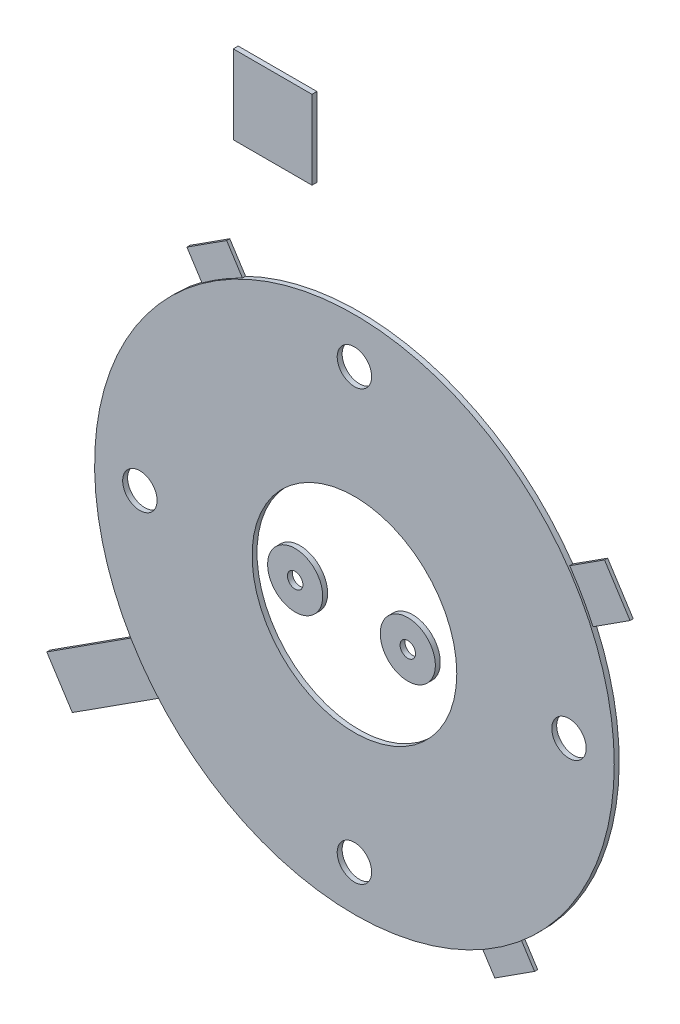
ISO-10303-21;
HEADER;
FILE_DESCRIPTION(('STEP AP214'),'2;1');
FILE_NAME('part.step','',(''),(''),'','','');
FILE_SCHEMA(('AUTOMOTIVE_DESIGN { 1 0 10303 214 1 1 1 1 }'));
ENDSEC;
DATA;
#1=APPLICATION_CONTEXT('core data for automotive mechanical design processes');
#2=APPLICATION_PROTOCOL_DEFINITION('international standard','automotive_design',2000,#1);
#3=PRODUCT_CONTEXT('',#1,'mechanical');
#4=PRODUCT('Part','Part','',(#3));
#5=PRODUCT_RELATED_PRODUCT_CATEGORY('part','',(#4));
#6=PRODUCT_DEFINITION_FORMATION('','',#4);
#7=PRODUCT_DEFINITION_CONTEXT('part definition',#1,'design');
#8=PRODUCT_DEFINITION('design','',#6,#7);
#9=PRODUCT_DEFINITION_SHAPE('','',#8);
#10=(LENGTH_UNIT() NAMED_UNIT(*) SI_UNIT(.MILLI.,.METRE.));
#11=(NAMED_UNIT(*) PLANE_ANGLE_UNIT() SI_UNIT($,.RADIAN.));
#12=(NAMED_UNIT(*) SI_UNIT($,.STERADIAN.) SOLID_ANGLE_UNIT());
#13=UNCERTAINTY_MEASURE_WITH_UNIT(LENGTH_MEASURE(1.E-05),#10,'distance_accuracy_value','');
#14=(GEOMETRIC_REPRESENTATION_CONTEXT(3) GLOBAL_UNCERTAINTY_ASSIGNED_CONTEXT((#13)) GLOBAL_UNIT_ASSIGNED_CONTEXT((#10,
#11,#12)) REPRESENTATION_CONTEXT('',''));
#15=CARTESIAN_POINT('',(0.,0.,0.));
#16=DIRECTION('',(0.,0.,1.));
#17=DIRECTION('',(1.,0.,0.));
#18=AXIS2_PLACEMENT_3D('',#15,#16,#17);
#19=CARTESIAN_POINT('',(-19.115371156758,0.,37.5085244842766));
#20=DIRECTION('',(0.,0.,-1.));
#21=DIRECTION('',(-1.,0.,0.));
#22=AXIS2_PLACEMENT_3D('',#19,#20,#21);
#23=CYLINDRICAL_SURFACE('',#22,8.89);
#24=CARTESIAN_POINT('',(-19.115371156758,0.,0.));
#25=DIRECTION('',(0.,0.,-1.));
#26=DIRECTION('',(-1.,0.,0.));
#27=AXIS2_PLACEMENT_3D('',#24,#25,#26);
#28=CIRCLE('',#27,8.89);
#29=CARTESIAN_POINT('',(-28.005371156758,0.,0.));
#30=VERTEX_POINT('',#29);
#31=EDGE_CURVE('E49',#30,#30,#28,.T.);
#32=ORIENTED_EDGE('',*,*,#31,.F.);
#33=EDGE_LOOP('',(#32));
#34=FACE_BOUND('',#33,.T.);
#35=CARTESIAN_POINT('',(-19.115371156758,0.,1.5875));
#36=DIRECTION('',(0.,0.,1.));
#37=DIRECTION('',(1.,0.,0.));
#38=AXIS2_PLACEMENT_3D('',#35,#36,#37);
#39=CIRCLE('',#38,8.89);
#40=CARTESIAN_POINT('',(-10.225371156758,0.,1.5875));
#41=VERTEX_POINT('',#40);
#42=EDGE_CURVE('E45',#41,#41,#39,.F.);
#43=ORIENTED_EDGE('',*,*,#42,.T.);
#44=EDGE_LOOP('',(#43));
#45=FACE_BOUND('',#44,.T.);
#46=ADVANCED_FACE('F41',(#34,#45),#23,.T.);
#47=CARTESIAN_POINT('',(-19.115371156758,0.,37.5085244842766));
#48=DIRECTION('',(0.,0.,-1.));
#49=DIRECTION('',(-1.,0.,0.));
#50=AXIS2_PLACEMENT_3D('',#47,#48,#49);
#51=CYLINDRICAL_SURFACE('',#50,2.4892);
#52=CARTESIAN_POINT('',(-19.115371156758,0.,0.));
#53=DIRECTION('',(0.,0.,-1.));
#54=DIRECTION('',(-1.,0.,0.));
#55=AXIS2_PLACEMENT_3D('',#52,#53,#54);
#56=CIRCLE('',#55,2.4892);
#57=CARTESIAN_POINT('',(-21.604571156758,0.,0.));
#58=VERTEX_POINT('',#57);
#59=EDGE_CURVE('E53',#58,#58,#56,.T.);
#60=ORIENTED_EDGE('',*,*,#59,.T.);
#61=EDGE_LOOP('',(#60));
#62=FACE_BOUND('',#61,.T.);
#63=CARTESIAN_POINT('',(-19.115371156758,0.,1.5875));
#64=DIRECTION('',(0.,0.,1.));
#65=DIRECTION('',(1.,0.,0.));
#66=AXIS2_PLACEMENT_3D('',#63,#64,#65);
#67=CIRCLE('',#66,2.4892);
#68=CARTESIAN_POINT('',(-16.626171156758,0.,1.5875));
#69=VERTEX_POINT('',#68);
#70=EDGE_CURVE('E11',#69,#69,#67,.F.);
#71=ORIENTED_EDGE('',*,*,#70,.F.);
#72=EDGE_LOOP('',(#71));
#73=FACE_BOUND('',#72,.T.);
#74=ADVANCED_FACE('F68',(#62,#73),#51,.F.);
#75=CARTESIAN_POINT('',(-19.115371156758,0.,0.));
#76=DIRECTION('',(0.,0.,-1.));
#77=DIRECTION('',(-1.,0.,0.));
#78=AXIS2_PLACEMENT_3D('',#75,#76,#77);
#79=PLANE('',#78);
#80=ORIENTED_EDGE('',*,*,#59,.F.);
#81=EDGE_LOOP('',(#80));
#82=FACE_BOUND('',#81,.T.);
#83=ORIENTED_EDGE('',*,*,#31,.T.);
#84=EDGE_LOOP('',(#83));
#85=FACE_BOUND('',#84,.T.);
#86=ADVANCED_FACE('F64',(#82,#85),#79,.T.);
#87=CARTESIAN_POINT('',(0.,0.,1.5875));
#88=DIRECTION('',(0.,0.,1.));
#89=DIRECTION('',(1.,0.,0.));
#90=AXIS2_PLACEMENT_3D('',#87,#88,#89);
#91=PLANE('',#90);
#92=ORIENTED_EDGE('',*,*,#42,.F.);
#93=EDGE_LOOP('',(#92));
#94=FACE_BOUND('',#93,.T.);
#95=ORIENTED_EDGE('',*,*,#70,.T.);
#96=EDGE_LOOP('',(#95));
#97=FACE_BOUND('',#96,.T.);
#98=ADVANCED_FACE('F43',(#94,#97),#91,.T.);
#99=CLOSED_SHELL('',(#46,#74,#86,#98));
#100=MANIFOLD_SOLID_BREP('B2',#99);
#101=CARTESIAN_POINT('',(17.2165453131115,-1.13803811640878,37.5085244842766));
#102=DIRECTION('',(0.,0.,-1.));
#103=DIRECTION('',(-1.,0.,0.));
#104=AXIS2_PLACEMENT_3D('',#101,#102,#103);
#105=CYLINDRICAL_SURFACE('',#104,8.89);
#106=CARTESIAN_POINT('',(17.2165453131115,-1.13803811640878,0.));
#107=DIRECTION('',(0.,0.,-1.));
#108=DIRECTION('',(-1.,0.,0.));
#109=AXIS2_PLACEMENT_3D('',#106,#107,#108);
#110=CIRCLE('',#109,8.89);
#111=CARTESIAN_POINT('',(8.32654531311145,-1.13803811640878,0.));
#112=VERTEX_POINT('',#111);
#113=EDGE_CURVE('E120',#112,#112,#110,.T.);
#114=ORIENTED_EDGE('',*,*,#113,.F.);
#115=EDGE_LOOP('',(#114));
#116=FACE_BOUND('',#115,.T.);
#117=CARTESIAN_POINT('',(17.2165453131115,-1.13803811640878,1.5875));
#118=DIRECTION('',(0.,0.,1.));
#119=DIRECTION('',(1.,0.,0.));
#120=AXIS2_PLACEMENT_3D('',#117,#118,#119);
#121=CIRCLE('',#120,8.89);
#122=CARTESIAN_POINT('',(26.1065453131115,-1.13803811640878,1.5875));
#123=VERTEX_POINT('',#122);
#124=EDGE_CURVE('E116',#123,#123,#121,.F.);
#125=ORIENTED_EDGE('',*,*,#124,.T.);
#126=EDGE_LOOP('',(#125));
#127=FACE_BOUND('',#126,.T.);
#128=ADVANCED_FACE('F112',(#116,#127),#105,.T.);
#129=CARTESIAN_POINT('',(17.2165453131115,-1.13803811640878,37.5085244842766));
#130=DIRECTION('',(0.,0.,-1.));
#131=DIRECTION('',(-1.,0.,0.));
#132=AXIS2_PLACEMENT_3D('',#129,#130,#131);
#133=CYLINDRICAL_SURFACE('',#132,2.4892);
#134=CARTESIAN_POINT('',(17.2165453131115,-1.13803811640878,0.));
#135=DIRECTION('',(0.,0.,-1.));
#136=DIRECTION('',(-1.,0.,0.));
#137=AXIS2_PLACEMENT_3D('',#134,#135,#136);
#138=CIRCLE('',#137,2.4892);
#139=CARTESIAN_POINT('',(14.7273453131115,-1.13803811640878,0.));
#140=VERTEX_POINT('',#139);
#141=EDGE_CURVE('E124',#140,#140,#138,.T.);
#142=ORIENTED_EDGE('',*,*,#141,.T.);
#143=EDGE_LOOP('',(#142));
#144=FACE_BOUND('',#143,.T.);
#145=CARTESIAN_POINT('',(17.2165453131115,-1.13803811640878,1.5875));
#146=DIRECTION('',(0.,0.,1.));
#147=DIRECTION('',(1.,0.,0.));
#148=AXIS2_PLACEMENT_3D('',#145,#146,#147);
#149=CIRCLE('',#148,2.4892);
#150=CARTESIAN_POINT('',(19.7057453131115,-1.13803811640878,1.5875));
#151=VERTEX_POINT('',#150);
#152=EDGE_CURVE('E40',#151,#151,#149,.F.);
#153=ORIENTED_EDGE('',*,*,#152,.F.);
#154=EDGE_LOOP('',(#153));
#155=FACE_BOUND('',#154,.T.);
#156=ADVANCED_FACE('F139',(#144,#155),#133,.F.);
#157=CARTESIAN_POINT('',(17.2165453131115,-1.13803811640878,0.));
#158=DIRECTION('',(0.,0.,-1.));
#159=DIRECTION('',(-1.,0.,0.));
#160=AXIS2_PLACEMENT_3D('',#157,#158,#159);
#161=PLANE('',#160);
#162=ORIENTED_EDGE('',*,*,#141,.F.);
#163=EDGE_LOOP('',(#162));
#164=FACE_BOUND('',#163,.T.);
#165=ORIENTED_EDGE('',*,*,#113,.T.);
#166=EDGE_LOOP('',(#165));
#167=FACE_BOUND('',#166,.T.);
#168=ADVANCED_FACE('F135',(#164,#167),#161,.T.);
#169=CARTESIAN_POINT('',(0.,0.,1.5875));
#170=DIRECTION('',(0.,0.,1.));
#171=DIRECTION('',(1.,0.,0.));
#172=AXIS2_PLACEMENT_3D('',#169,#170,#171);
#173=PLANE('',#172);
#174=ORIENTED_EDGE('',*,*,#124,.F.);
#175=EDGE_LOOP('',(#174));
#176=FACE_BOUND('',#175,.T.);
#177=ORIENTED_EDGE('',*,*,#152,.T.);
#178=EDGE_LOOP('',(#177));
#179=FACE_BOUND('',#178,.T.);
#180=ADVANCED_FACE('F114',(#176,#179),#173,.T.);
#181=CLOSED_SHELL('',(#128,#156,#168,#180));
#182=MANIFOLD_SOLID_BREP('B6',#181);
#183=CARTESIAN_POINT('',(0.,0.,1.5875));
#184=DIRECTION('',(0.,0.,1.));
#185=DIRECTION('',(1.,0.,0.));
#186=AXIS2_PLACEMENT_3D('',#183,#184,#185);
#187=PLANE('',#186);
#188=DIRECTION('',(0.,-1.,0.));
#189=VECTOR('',#188,1.);
#190=CARTESIAN_POINT('',(-13.690137184174,138.482482189097,1.5875));
#191=LINE('',#190,#189);
#192=CARTESIAN_POINT('',(-13.690137184174,138.482482189097,1.5875));
#193=VERTEX_POINT('',#192);
#194=CARTESIAN_POINT('',(-13.690137184174,113.082482189097,1.5875));
#195=VERTEX_POINT('',#194);
#196=EDGE_CURVE('E190',#193,#195,#191,.T.);
#197=ORIENTED_EDGE('',*,*,#196,.F.);
#198=DIRECTION('',(1.,0.,0.));
#199=VECTOR('',#198,1.);
#200=CARTESIAN_POINT('',(-13.690137184174,138.482482189097,1.5875));
#201=LINE('',#200,#199);
#202=CARTESIAN_POINT('',(-39.090137184174,138.482482189097,1.5875));
#203=VERTEX_POINT('',#202);
#204=EDGE_CURVE('E213',#203,#193,#201,.T.);
#205=ORIENTED_EDGE('',*,*,#204,.F.);
#206=DIRECTION('',(0.,1.,0.));
#207=VECTOR('',#206,1.);
#208=CARTESIAN_POINT('',(-39.090137184174,138.482482189097,1.5875));
#209=LINE('',#208,#207);
#210=CARTESIAN_POINT('',(-39.090137184174,113.082482189097,1.5875));
#211=VERTEX_POINT('',#210);
#212=EDGE_CURVE('E218',#211,#203,#209,.T.);
#213=ORIENTED_EDGE('',*,*,#212,.F.);
#214=DIRECTION('',(-1.,0.,0.));
#215=VECTOR('',#214,1.);
#216=CARTESIAN_POINT('',(-13.690137184174,113.082482189097,1.5875));
#217=LINE('',#216,#215);
#218=EDGE_CURVE('E233',#195,#211,#217,.T.);
#219=ORIENTED_EDGE('',*,*,#218,.F.);
#220=EDGE_LOOP('',(#197,#205,#213,#219));
#221=FACE_BOUND('',#220,.T.);
#222=ADVANCED_FACE('F182',(#221),#187,.T.);
#223=CARTESIAN_POINT('',(0.,0.,0.));
#224=DIRECTION('',(0.,0.,-1.));
#225=DIRECTION('',(-1.,0.,0.));
#226=AXIS2_PLACEMENT_3D('',#223,#224,#225);
#227=PLANE('',#226);
#228=DIRECTION('',(0.,-1.,0.));
#229=VECTOR('',#228,1.);
#230=CARTESIAN_POINT('',(-13.690137184174,138.482482189097,0.));
#231=LINE('',#230,#229);
#232=CARTESIAN_POINT('',(-13.690137184174,138.482482189097,0.));
#233=VERTEX_POINT('',#232);
#234=CARTESIAN_POINT('',(-13.690137184174,113.082482189097,0.));
#235=VERTEX_POINT('',#234);
#236=EDGE_CURVE('E242',#233,#235,#231,.T.);
#237=ORIENTED_EDGE('',*,*,#236,.T.);
#238=DIRECTION('',(-1.,0.,0.));
#239=VECTOR('',#238,1.);
#240=CARTESIAN_POINT('',(-13.690137184174,113.082482189097,0.));
#241=LINE('',#240,#239);
#242=CARTESIAN_POINT('',(-39.090137184174,113.082482189097,0.));
#243=VERTEX_POINT('',#242);
#244=EDGE_CURVE('E231',#235,#243,#241,.T.);
#245=ORIENTED_EDGE('',*,*,#244,.T.);
#246=DIRECTION('',(0.,1.,0.));
#247=VECTOR('',#246,1.);
#248=CARTESIAN_POINT('',(-39.090137184174,138.482482189097,0.));
#249=LINE('',#248,#247);
#250=CARTESIAN_POINT('',(-39.090137184174,138.482482189097,0.));
#251=VERTEX_POINT('',#250);
#252=EDGE_CURVE('E234',#243,#251,#249,.T.);
#253=ORIENTED_EDGE('',*,*,#252,.T.);
#254=DIRECTION('',(1.,0.,0.));
#255=VECTOR('',#254,1.);
#256=CARTESIAN_POINT('',(-13.690137184174,138.482482189097,0.));
#257=LINE('',#256,#255);
#258=EDGE_CURVE('E239',#251,#233,#257,.T.);
#259=ORIENTED_EDGE('',*,*,#258,.T.);
#260=EDGE_LOOP('',(#237,#245,#253,#259));
#261=FACE_BOUND('',#260,.T.);
#262=ADVANCED_FACE('F241',(#261),#227,.T.);
#263=CARTESIAN_POINT('',(-13.690137184174,113.082482189097,37.5085244842766));
#264=DIRECTION('',(0.,-1.,0.));
#265=DIRECTION('',(0.,0.,-1.));
#266=AXIS2_PLACEMENT_3D('',#263,#264,#265);
#267=PLANE('',#266);
#268=DIRECTION('',(0.,0.,-1.));
#269=VECTOR('',#268,1.);
#270=CARTESIAN_POINT('',(-13.690137184174,113.082482189097,37.5085244842766));
#271=LINE('',#270,#269);
#272=EDGE_CURVE('E110',#195,#235,#271,.T.);
#273=ORIENTED_EDGE('',*,*,#272,.F.);
#274=ORIENTED_EDGE('',*,*,#218,.T.);
#275=DIRECTION('',(0.,0.,-1.));
#276=VECTOR('',#275,1.);
#277=CARTESIAN_POINT('',(-39.090137184174,113.082482189097,37.5085244842766));
#278=LINE('',#277,#276);
#279=EDGE_CURVE('E228',#211,#243,#278,.T.);
#280=ORIENTED_EDGE('',*,*,#279,.T.);
#281=ORIENTED_EDGE('',*,*,#244,.F.);
#282=EDGE_LOOP('',(#273,#274,#280,#281));
#283=FACE_BOUND('',#282,.T.);
#284=ADVANCED_FACE('F229',(#283),#267,.T.);
#285=CARTESIAN_POINT('',(-39.090137184174,138.482482189097,37.5085244842766));
#286=DIRECTION('',(-1.,0.,0.));
#287=DIRECTION('',(0.,0.,1.));
#288=AXIS2_PLACEMENT_3D('',#285,#286,#287);
#289=PLANE('',#288);
#290=ORIENTED_EDGE('',*,*,#279,.F.);
#291=ORIENTED_EDGE('',*,*,#212,.T.);
#292=DIRECTION('',(0.,0.,-1.));
#293=VECTOR('',#292,1.);
#294=CARTESIAN_POINT('',(-39.090137184174,138.482482189097,37.5085244842766));
#295=LINE('',#294,#293);
#296=EDGE_CURVE('E223',#203,#251,#295,.T.);
#297=ORIENTED_EDGE('',*,*,#296,.T.);
#298=ORIENTED_EDGE('',*,*,#252,.F.);
#299=EDGE_LOOP('',(#290,#291,#297,#298));
#300=FACE_BOUND('',#299,.T.);
#301=ADVANCED_FACE('F235',(#300),#289,.T.);
#302=CARTESIAN_POINT('',(-13.690137184174,138.482482189097,37.5085244842766));
#303=DIRECTION('',(0.,1.,0.));
#304=DIRECTION('',(0.,0.,1.));
#305=AXIS2_PLACEMENT_3D('',#302,#303,#304);
#306=PLANE('',#305);
#307=ORIENTED_EDGE('',*,*,#296,.F.);
#308=ORIENTED_EDGE('',*,*,#204,.T.);
#309=DIRECTION('',(0.,0.,-1.));
#310=VECTOR('',#309,1.);
#311=CARTESIAN_POINT('',(-13.690137184174,138.482482189097,37.5085244842766));
#312=LINE('',#311,#310);
#313=EDGE_CURVE('E249',#193,#233,#312,.T.);
#314=ORIENTED_EDGE('',*,*,#313,.T.);
#315=ORIENTED_EDGE('',*,*,#258,.F.);
#316=EDGE_LOOP('',(#307,#308,#314,#315));
#317=FACE_BOUND('',#316,.T.);
#318=ADVANCED_FACE('F255',(#317),#306,.T.);
#319=CARTESIAN_POINT('',(-13.690137184174,138.482482189097,37.5085244842766));
#320=DIRECTION('',(1.,0.,0.));
#321=DIRECTION('',(0.,0.,-1.));
#322=AXIS2_PLACEMENT_3D('',#319,#320,#321);
#323=PLANE('',#322);
#324=ORIENTED_EDGE('',*,*,#313,.F.);
#325=ORIENTED_EDGE('',*,*,#196,.T.);
#326=ORIENTED_EDGE('',*,*,#272,.T.);
#327=ORIENTED_EDGE('',*,*,#236,.F.);
#328=EDGE_LOOP('',(#324,#325,#326,#327));
#329=FACE_BOUND('',#328,.T.);
#330=ADVANCED_FACE('F256',(#329),#323,.T.);
#331=CLOSED_SHELL('',(#222,#262,#284,#301,#318,#330));
#332=MANIFOLD_SOLID_BREP('B35',#331);
#333=CARTESIAN_POINT('',(0.,0.,1.5875));
#334=DIRECTION('',(0.,0.,1.));
#335=DIRECTION('',(1.,0.,0.));
#336=AXIS2_PLACEMENT_3D('',#333,#334,#335);
#337=PLANE('',#336);
#338=CARTESIAN_POINT('',(69.215,0.,1.5875));
#339=DIRECTION('',(0.,0.,1.));
#340=DIRECTION('',(1.,0.,0.));
#341=AXIS2_PLACEMENT_3D('',#338,#339,#340);
#342=CIRCLE('',#341,5.55625000000002);
#343=CARTESIAN_POINT('',(74.77125,0.,1.5875));
#344=VERTEX_POINT('',#343);
#345=EDGE_CURVE('E516',#344,#344,#342,.T.);
#346=ORIENTED_EDGE('',*,*,#345,.F.);
#347=EDGE_LOOP('',(#346));
#348=FACE_BOUND('',#347,.T.);
#349=CARTESIAN_POINT('',(-69.215,0.,1.5875));
#350=DIRECTION('',(0.,0.,1.));
#351=DIRECTION('',(1.,0.,0.));
#352=AXIS2_PLACEMENT_3D('',#349,#350,#351);
#353=CIRCLE('',#352,5.55625);
#354=CARTESIAN_POINT('',(-63.65875,0.,1.5875));
#355=VERTEX_POINT('',#354);
#356=EDGE_CURVE('E528',#355,#355,#353,.T.);
#357=ORIENTED_EDGE('',*,*,#356,.F.);
#358=EDGE_LOOP('',(#357));
#359=FACE_BOUND('',#358,.T.);
#360=CARTESIAN_POINT('',(0.,0.,1.5875));
#361=DIRECTION('',(0.,0.,1.));
#362=DIRECTION('',(1.,0.,0.));
#363=AXIS2_PLACEMENT_3D('',#360,#361,#362);
#364=CIRCLE('',#363,83.82);
#365=CARTESIAN_POINT('',(83.82,0.,1.5875));
#366=VERTEX_POINT('',#365);
#367=EDGE_CURVE('E540',#366,#366,#364,.T.);
#368=ORIENTED_EDGE('',*,*,#367,.T.);
#369=EDGE_LOOP('',(#368));
#370=FACE_BOUND('',#369,.T.);
#371=CARTESIAN_POINT('',(0.,0.,1.5875));
#372=DIRECTION('',(0.,0.,1.));
#373=DIRECTION('',(1.,0.,0.));
#374=AXIS2_PLACEMENT_3D('',#371,#372,#373);
#375=CIRCLE('',#374,33.02);
#376=CARTESIAN_POINT('',(33.02,0.,1.5875));
#377=VERTEX_POINT('',#376);
#378=EDGE_CURVE('E534',#377,#377,#375,.T.);
#379=ORIENTED_EDGE('',*,*,#378,.F.);
#380=EDGE_LOOP('',(#379));
#381=FACE_BOUND('',#380,.T.);
#382=CARTESIAN_POINT('',(0.,69.215,1.5875));
#383=DIRECTION('',(0.,0.,1.));
#384=DIRECTION('',(1.,0.,0.));
#385=AXIS2_PLACEMENT_3D('',#382,#383,#384);
#386=CIRCLE('',#385,5.55624999999999);
#387=CARTESIAN_POINT('',(5.55624999999999,69.215,1.5875));
#388=VERTEX_POINT('',#387);
#389=EDGE_CURVE('E522',#388,#388,#386,.T.);
#390=ORIENTED_EDGE('',*,*,#389,.F.);
#391=EDGE_LOOP('',(#390));
#392=FACE_BOUND('',#391,.T.);
#393=CARTESIAN_POINT('',(0.,-69.215,1.5875));
#394=DIRECTION('',(0.,0.,1.));
#395=DIRECTION('',(1.,0.,0.));
#396=AXIS2_PLACEMENT_3D('',#393,#394,#395);
#397=CIRCLE('',#396,5.55624999999999);
#398=CARTESIAN_POINT('',(5.55624999999999,-69.215,1.5875));
#399=VERTEX_POINT('',#398);
#400=EDGE_CURVE('E510',#399,#399,#397,.T.);
#401=ORIENTED_EDGE('',*,*,#400,.F.);
#402=EDGE_LOOP('',(#401));
#403=FACE_BOUND('',#402,.T.);
#404=ADVANCED_FACE('F305',(#348,#359,#370,#381,#392,#403),#337,.T.);
#405=CARTESIAN_POINT('',(0.,0.,0.));
#406=DIRECTION('',(0.,0.,1.));
#407=DIRECTION('',(1.,0.,0.));
#408=AXIS2_PLACEMENT_3D('',#405,#406,#407);
#409=PLANE('',#408);
#410=DIRECTION('',(0.841208650230531,0.540710649772435,0.));
#411=VECTOR('',#410,1.);
#412=CARTESIAN_POINT('',(-53.9080953398317,-31.1364566302345,0.));
#413=LINE('',#412,#411);
#414=CARTESIAN_POINT('',(-99.8144587122875,-60.6440699447287,0.));
#415=VERTEX_POINT('',#414);
#416=CARTESIAN_POINT('',(-72.0648065841038,-42.8071962641296,0.));
#417=VERTEX_POINT('',#416);
#418=EDGE_CURVE('E439',#415,#417,#413,.T.);
#419=ORIENTED_EDGE('',*,*,#418,.T.);
#420=CARTESIAN_POINT('',(0.,0.,0.));
#421=DIRECTION('',(0.,0.,1.));
#422=DIRECTION('',(1.,0.,0.));
#423=AXIS2_PLACEMENT_3D('',#420,#421,#422);
#424=CIRCLE('',#423,83.82);
#425=CARTESIAN_POINT('',(-49.7423472905781,67.4647410580039,0.));
#426=VERTEX_POINT('',#425);
#427=EDGE_CURVE('E546',#426,#417,#424,.T.);
#428=ORIENTED_EDGE('',*,*,#427,.F.);
#429=DIRECTION('',(-0.540710649772435,0.84120865023053,0.));
#430=VECTOR('',#429,1.);
#431=CARTESIAN_POINT('',(-44.1784904359033,58.808790751187,0.));
#432=LINE('',#431,#430);
#433=CARTESIAN_POINT('',(-54.6166201182401,75.0478734929551,0.));
#434=VERTEX_POINT('',#433);
#435=EDGE_CURVE('E459',#426,#434,#432,.T.);
#436=ORIENTED_EDGE('',*,*,#435,.T.);
#437=DIRECTION('',(0.841208650230531,0.540710649772434,0.));
#438=VECTOR('',#437,1.);
#439=CARTESIAN_POINT('',(-41.7966002887268,83.288303795487,0.));
#440=LINE('',#439,#438);
#441=CARTESIAN_POINT('',(-41.7966002887268,83.288303795487,0.));
#442=VERTEX_POINT('',#441);
#443=EDGE_CURVE('E451',#434,#442,#440,.T.);
#444=ORIENTED_EDGE('',*,*,#443,.T.);
#445=DIRECTION('',(0.540710649772435,-0.841208650230531,0.));
#446=VECTOR('',#445,1.);
#447=CARTESIAN_POINT('',(-31.35847060639,67.0492210537189,0.));
#448=LINE('',#447,#446);
#449=CARTESIAN_POINT('',(-36.6996114754435,75.3586817662802,0.));
#450=VERTEX_POINT('',#449);
#451=EDGE_CURVE('E445',#442,#450,#448,.T.);
#452=ORIENTED_EDGE('',*,*,#451,.T.);
#453=CARTESIAN_POINT('',(68.8676660465004,47.7811361659358,0.));
#454=VERTEX_POINT('',#453);
#455=EDGE_CURVE('E544',#454,#450,#424,.T.);
#456=ORIENTED_EDGE('',*,*,#455,.F.);
#457=DIRECTION('',(0.841208650230531,0.540710649772435,0.));
#458=VECTOR('',#457,1.);
#459=CARTESIAN_POINT('',(58.5933201152434,41.1770097545463,0.));
#460=LINE('',#459,#458);
#461=CARTESIAN_POINT('',(80.1050038135126,55.0042528136881,0.));
#462=VERTEX_POINT('',#461);
#463=EDGE_CURVE('E486',#454,#462,#460,.T.);
#464=ORIENTED_EDGE('',*,*,#463,.T.);
#465=DIRECTION('',(0.540710649772434,-0.841208650230531,0.));
#466=VECTOR('',#465,1.);
#467=CARTESIAN_POINT('',(80.1050038135126,55.0042528136881,0.));
#468=LINE('',#467,#466);
#469=CARTESIAN_POINT('',(88.3454341160444,42.184232984175,0.));
#470=VERTEX_POINT('',#469);
#471=EDGE_CURVE('E500',#462,#470,#468,.T.);
#472=ORIENTED_EDGE('',*,*,#471,.T.);
#473=DIRECTION('',(-0.84120865023053,-0.540710649772436,0.));
#474=VECTOR('',#473,1.);
#475=CARTESIAN_POINT('',(66.8337504177752,28.3569899250331,0.));
#476=LINE('',#475,#474);
#477=CARTESIAN_POINT('',(76.3907206709252,34.5000028315461,0.));
#478=VERTEX_POINT('',#477);
#479=EDGE_CURVE('E492',#470,#478,#476,.T.);
#480=ORIENTED_EDGE('',*,*,#479,.T.);
#481=CARTESIAN_POINT('',(53.3138375609136,-64.6794180905218,0.));
#482=VERTEX_POINT('',#481);
#483=EDGE_CURVE('E537',#482,#478,#424,.T.);
#484=ORIENTED_EDGE('',*,*,#483,.F.);
#485=DIRECTION('',(0.540710649772436,-0.84120865023053,0.));
#486=VECTOR('',#485,1.);
#487=CARTESIAN_POINT('',(48.5277998812423,-57.2335571699663,0.));
#488=LINE('',#487,#486);
#489=CARTESIAN_POINT('',(57.5312655469694,-71.2406665236487,0.));
#490=VERTEX_POINT('',#489);
#491=EDGE_CURVE('E465',#482,#490,#488,.T.);
#492=ORIENTED_EDGE('',*,*,#491,.T.);
#493=DIRECTION('',(-0.84120865023053,-0.540710649772436,0.));
#494=VECTOR('',#493,1.);
#495=CARTESIAN_POINT('',(57.5312655469694,-71.2406665236487,0.));
#496=LINE('',#495,#494);
#497=CARTESIAN_POINT('',(44.7112457174561,-79.4810968261806,0.));
#498=VERTEX_POINT('',#497);
#499=EDGE_CURVE('E479',#490,#498,#496,.T.);
#500=ORIENTED_EDGE('',*,*,#499,.T.);
#501=DIRECTION('',(-0.540710649772435,0.84120865023053,0.));
#502=VECTOR('',#501,1.);
#503=CARTESIAN_POINT('',(35.7077800517291,-65.4739874724982,0.));
#504=LINE('',#503,#502);
#505=CARTESIAN_POINT('',(40.7165337170217,-73.2663379873092,0.));
#506=VERTEX_POINT('',#505);
#507=EDGE_CURVE('E471',#498,#506,#504,.T.);
#508=ORIENTED_EDGE('',*,*,#507,.T.);
#509=CARTESIAN_POINT('',(-63.1070006034648,-55.1661025887663,0.));
#510=VERTEX_POINT('',#509);
#511=EDGE_CURVE('E547',#510,#506,#424,.T.);
#512=ORIENTED_EDGE('',*,*,#511,.F.);
#513=DIRECTION('',(-0.84120865023053,-0.540710649772435,0.));
#514=VECTOR('',#513,1.);
#515=CARTESIAN_POINT('',(-45.6676650372998,-43.9564764597478,0.));
#516=LINE('',#515,#514);
#517=CARTESIAN_POINT('',(-91.5740284097556,-73.464089774242,0.));
#518=VERTEX_POINT('',#517);
#519=EDGE_CURVE('E442',#510,#518,#516,.T.);
#520=ORIENTED_EDGE('',*,*,#519,.T.);
#521=DIRECTION('',(-0.540710649772436,0.84120865023053,0.));
#522=VECTOR('',#521,1.);
#523=CARTESIAN_POINT('',(-99.8144587122875,-60.6440699447287,0.));
#524=LINE('',#523,#522);
#525=EDGE_CURVE('E430',#518,#415,#524,.T.);
#526=ORIENTED_EDGE('',*,*,#525,.T.);
#527=EDGE_LOOP('',(#419,#428,#436,#444,#452,#456,#464,#472,#480,#484,#492,#500,#508,#512,#520,#526));
#528=FACE_BOUND('',#527,.T.);
#529=CARTESIAN_POINT('',(0.,0.,0.));
#530=DIRECTION('',(0.,0.,1.));
#531=DIRECTION('',(1.,0.,0.));
#532=AXIS2_PLACEMENT_3D('',#529,#530,#531);
#533=CIRCLE('',#532,33.02);
#534=CARTESIAN_POINT('',(33.02,0.,0.));
#535=VERTEX_POINT('',#534);
#536=EDGE_CURVE('E531',#535,#535,#533,.T.);
#537=ORIENTED_EDGE('',*,*,#536,.T.);
#538=EDGE_LOOP('',(#537));
#539=FACE_BOUND('',#538,.T.);
#540=CARTESIAN_POINT('',(-69.215,0.,0.));
#541=DIRECTION('',(0.,0.,1.));
#542=DIRECTION('',(1.,0.,0.));
#543=AXIS2_PLACEMENT_3D('',#540,#541,#542);
#544=CIRCLE('',#543,5.55625);
#545=CARTESIAN_POINT('',(-63.65875,0.,0.));
#546=VERTEX_POINT('',#545);
#547=EDGE_CURVE('E525',#546,#546,#544,.T.);
#548=ORIENTED_EDGE('',*,*,#547,.T.);
#549=EDGE_LOOP('',(#548));
#550=FACE_BOUND('',#549,.T.);
#551=CARTESIAN_POINT('',(0.,69.215,0.));
#552=DIRECTION('',(0.,0.,1.));
#553=DIRECTION('',(1.,0.,0.));
#554=AXIS2_PLACEMENT_3D('',#551,#552,#553);
#555=CIRCLE('',#554,5.55624999999999);
#556=CARTESIAN_POINT('',(5.55624999999999,69.215,0.));
#557=VERTEX_POINT('',#556);
#558=EDGE_CURVE('E519',#557,#557,#555,.T.);
#559=ORIENTED_EDGE('',*,*,#558,.T.);
#560=EDGE_LOOP('',(#559));
#561=FACE_BOUND('',#560,.T.);
#562=CARTESIAN_POINT('',(69.215,0.,0.));
#563=DIRECTION('',(0.,0.,1.));
#564=DIRECTION('',(1.,0.,0.));
#565=AXIS2_PLACEMENT_3D('',#562,#563,#564);
#566=CIRCLE('',#565,5.55625000000002);
#567=CARTESIAN_POINT('',(74.77125,0.,0.));
#568=VERTEX_POINT('',#567);
#569=EDGE_CURVE('E513',#568,#568,#566,.T.);
#570=ORIENTED_EDGE('',*,*,#569,.T.);
#571=EDGE_LOOP('',(#570));
#572=FACE_BOUND('',#571,.T.);
#573=CARTESIAN_POINT('',(0.,-69.215,0.));
#574=DIRECTION('',(0.,0.,1.));
#575=DIRECTION('',(1.,0.,0.));
#576=AXIS2_PLACEMENT_3D('',#573,#574,#575);
#577=CIRCLE('',#576,5.55624999999999);
#578=CARTESIAN_POINT('',(5.55624999999999,-69.215,0.));
#579=VERTEX_POINT('',#578);
#580=EDGE_CURVE('E507',#579,#579,#577,.T.);
#581=ORIENTED_EDGE('',*,*,#580,.T.);
#582=EDGE_LOOP('',(#581));
#583=FACE_BOUND('',#582,.T.);
#584=ADVANCED_FACE('F573',(#528,#539,#550,#561,#572,#583),#409,.F.);
#585=CARTESIAN_POINT('',(0.,0.,1.5875));
#586=DIRECTION('',(0.,0.,-1.));
#587=DIRECTION('',(-1.,0.,0.));
#588=AXIS2_PLACEMENT_3D('',#585,#586,#587);
#589=CYLINDRICAL_SURFACE('',#588,83.82);
#590=ORIENTED_EDGE('',*,*,#427,.T.);
#591=DIRECTION('',(0.,0.,-1.));
#592=VECTOR('',#591,1.);
#593=CARTESIAN_POINT('',(-72.0648065841038,-42.8071962641296,1.5875));
#594=LINE('',#593,#592);
#595=CARTESIAN_POINT('',(-72.0648065841038,-42.8071962641296,1.016));
#596=VERTEX_POINT('',#595);
#597=EDGE_CURVE('E180',#417,#596,#594,.F.);
#598=ORIENTED_EDGE('',*,*,#597,.T.);
#599=CARTESIAN_POINT('',(0.,0.,1.016));
#600=DIRECTION('',(0.,0.,1.));
#601=DIRECTION('',(1.,0.,0.));
#602=AXIS2_PLACEMENT_3D('',#599,#600,#601);
#603=CIRCLE('',#602,83.82);
#604=CARTESIAN_POINT('',(-63.1070006034648,-55.1661025887663,1.016));
#605=VERTEX_POINT('',#604);
#606=EDGE_CURVE('E319',#596,#605,#603,.T.);
#607=ORIENTED_EDGE('',*,*,#606,.T.);
#608=DIRECTION('',(0.,0.,-1.));
#609=VECTOR('',#608,1.);
#610=CARTESIAN_POINT('',(-63.1070006034648,-55.1661025887664,1.5875));
#611=LINE('',#610,#609);
#612=EDGE_CURVE('E313',#605,#510,#611,.T.);
#613=ORIENTED_EDGE('',*,*,#612,.T.);
#614=ORIENTED_EDGE('',*,*,#511,.T.);
#615=DIRECTION('',(0.,0.,-1.));
#616=VECTOR('',#615,1.);
#617=CARTESIAN_POINT('',(40.7165337170217,-73.2663379873092,1.5875));
#618=LINE('',#617,#616);
#619=CARTESIAN_POINT('',(40.7165337170217,-73.2663379873092,1.016));
#620=VERTEX_POINT('',#619);
#621=EDGE_CURVE('E558',#506,#620,#618,.F.);
#622=ORIENTED_EDGE('',*,*,#621,.T.);
#623=CARTESIAN_POINT('',(0.,0.,1.016));
#624=DIRECTION('',(0.,0.,-1.));
#625=DIRECTION('',(-1.,0.,0.));
#626=AXIS2_PLACEMENT_3D('',#623,#624,#625);
#627=CIRCLE('',#626,83.82);
#628=CARTESIAN_POINT('',(53.3138375609136,-64.6794180905218,1.016));
#629=VERTEX_POINT('',#628);
#630=EDGE_CURVE('E555',#629,#620,#627,.T.);
#631=ORIENTED_EDGE('',*,*,#630,.F.);
#632=DIRECTION('',(0.,0.,-1.));
#633=VECTOR('',#632,1.);
#634=CARTESIAN_POINT('',(53.3138375609136,-64.6794180905218,1.5875));
#635=LINE('',#634,#633);
#636=EDGE_CURVE('E560',#629,#482,#635,.T.);
#637=ORIENTED_EDGE('',*,*,#636,.T.);
#638=ORIENTED_EDGE('',*,*,#483,.T.);
#639=DIRECTION('',(0.,0.,-1.));
#640=VECTOR('',#639,1.);
#641=CARTESIAN_POINT('',(76.3907206709252,34.5000028315461,1.5875));
#642=LINE('',#641,#640);
#643=CARTESIAN_POINT('',(76.3907206709252,34.5000028315461,1.016));
#644=VERTEX_POINT('',#643);
#645=EDGE_CURVE('E550',#478,#644,#642,.F.);
#646=ORIENTED_EDGE('',*,*,#645,.T.);
#647=CARTESIAN_POINT('',(0.,0.,1.016));
#648=DIRECTION('',(0.,0.,-1.));
#649=DIRECTION('',(-1.,0.,0.));
#650=AXIS2_PLACEMENT_3D('',#647,#648,#649);
#651=CIRCLE('',#650,83.82);
#652=CARTESIAN_POINT('',(68.8676660465004,47.7811361659358,1.016));
#653=VERTEX_POINT('',#652);
#654=EDGE_CURVE('E543',#653,#644,#651,.T.);
#655=ORIENTED_EDGE('',*,*,#654,.F.);
#656=DIRECTION('',(0.,0.,-1.));
#657=VECTOR('',#656,1.);
#658=CARTESIAN_POINT('',(68.8676660465004,47.7811361659358,1.5875));
#659=LINE('',#658,#657);
#660=EDGE_CURVE('E552',#653,#454,#659,.T.);
#661=ORIENTED_EDGE('',*,*,#660,.T.);
#662=ORIENTED_EDGE('',*,*,#455,.T.);
#663=DIRECTION('',(0.,0.,-1.));
#664=VECTOR('',#663,1.);
#665=CARTESIAN_POINT('',(-36.6996114754435,75.3586817662802,1.5875));
#666=LINE('',#665,#664);
#667=CARTESIAN_POINT('',(-36.6996114754435,75.3586817662802,1.016));
#668=VERTEX_POINT('',#667);
#669=EDGE_CURVE('E568',#450,#668,#666,.F.);
#670=ORIENTED_EDGE('',*,*,#669,.T.);
#671=CARTESIAN_POINT('',(0.,0.,1.016));
#672=DIRECTION('',(0.,0.,1.));
#673=DIRECTION('',(1.,0.,0.));
#674=AXIS2_PLACEMENT_3D('',#671,#672,#673);
#675=CIRCLE('',#674,83.82);
#676=CARTESIAN_POINT('',(-49.7423472905781,67.4647410580039,1.016));
#677=VERTEX_POINT('',#676);
#678=EDGE_CURVE('E563',#668,#677,#675,.T.);
#679=ORIENTED_EDGE('',*,*,#678,.T.);
#680=DIRECTION('',(0.,0.,-1.));
#681=VECTOR('',#680,1.);
#682=CARTESIAN_POINT('',(-49.7423472905781,67.4647410580039,1.5875));
#683=LINE('',#682,#681);
#684=EDGE_CURVE('E565',#677,#426,#683,.T.);
#685=ORIENTED_EDGE('',*,*,#684,.T.);
#686=EDGE_LOOP('',(#590,#598,#607,#613,#614,#622,#631,#637,#638,#646,#655,#661,#662,#670,#679,#685));
#687=FACE_BOUND('',#686,.T.);
#688=ORIENTED_EDGE('',*,*,#367,.F.);
#689=EDGE_LOOP('',(#688));
#690=FACE_BOUND('',#689,.T.);
#691=ADVANCED_FACE('F307',(#687,#690),#589,.T.);
#692=CARTESIAN_POINT('',(0.,0.,1.5875));
#693=DIRECTION('',(0.,0.,-1.));
#694=DIRECTION('',(-1.,0.,0.));
#695=AXIS2_PLACEMENT_3D('',#692,#693,#694);
#696=CYLINDRICAL_SURFACE('',#695,33.02);
#697=ORIENTED_EDGE('',*,*,#378,.T.);
#698=EDGE_LOOP('',(#697));
#699=FACE_BOUND('',#698,.T.);
#700=ORIENTED_EDGE('',*,*,#536,.F.);
#701=EDGE_LOOP('',(#700));
#702=FACE_BOUND('',#701,.T.);
#703=ADVANCED_FACE('F617',(#699,#702),#696,.F.);
#704=CARTESIAN_POINT('',(-69.215,0.,1.5875));
#705=DIRECTION('',(0.,0.,-1.));
#706=DIRECTION('',(-1.,0.,0.));
#707=AXIS2_PLACEMENT_3D('',#704,#705,#706);
#708=CYLINDRICAL_SURFACE('',#707,5.55625);
#709=ORIENTED_EDGE('',*,*,#356,.T.);
#710=EDGE_LOOP('',(#709));
#711=FACE_BOUND('',#710,.T.);
#712=ORIENTED_EDGE('',*,*,#547,.F.);
#713=EDGE_LOOP('',(#712));
#714=FACE_BOUND('',#713,.T.);
#715=ADVANCED_FACE('F620',(#711,#714),#708,.F.);
#716=CARTESIAN_POINT('',(0.,69.215,1.5875));
#717=DIRECTION('',(0.,0.,-1.));
#718=DIRECTION('',(-1.,0.,0.));
#719=AXIS2_PLACEMENT_3D('',#716,#717,#718);
#720=CYLINDRICAL_SURFACE('',#719,5.55624999999999);
#721=ORIENTED_EDGE('',*,*,#389,.T.);
#722=EDGE_LOOP('',(#721));
#723=FACE_BOUND('',#722,.T.);
#724=ORIENTED_EDGE('',*,*,#558,.F.);
#725=EDGE_LOOP('',(#724));
#726=FACE_BOUND('',#725,.T.);
#727=ADVANCED_FACE('F624',(#723,#726),#720,.F.);
#728=CARTESIAN_POINT('',(69.215,0.,1.5875));
#729=DIRECTION('',(0.,0.,-1.));
#730=DIRECTION('',(-1.,0.,0.));
#731=AXIS2_PLACEMENT_3D('',#728,#729,#730);
#732=CYLINDRICAL_SURFACE('',#731,5.55625000000002);
#733=ORIENTED_EDGE('',*,*,#345,.T.);
#734=EDGE_LOOP('',(#733));
#735=FACE_BOUND('',#734,.T.);
#736=ORIENTED_EDGE('',*,*,#569,.F.);
#737=EDGE_LOOP('',(#736));
#738=FACE_BOUND('',#737,.T.);
#739=ADVANCED_FACE('F604',(#735,#738),#732,.F.);
#740=CARTESIAN_POINT('',(0.,-69.215,1.5875));
#741=DIRECTION('',(0.,0.,-1.));
#742=DIRECTION('',(-1.,0.,0.));
#743=AXIS2_PLACEMENT_3D('',#740,#741,#742);
#744=CYLINDRICAL_SURFACE('',#743,5.55624999999999);
#745=ORIENTED_EDGE('',*,*,#400,.T.);
#746=EDGE_LOOP('',(#745));
#747=FACE_BOUND('',#746,.T.);
#748=ORIENTED_EDGE('',*,*,#580,.F.);
#749=EDGE_LOOP('',(#748));
#750=FACE_BOUND('',#749,.T.);
#751=ADVANCED_FACE('F596',(#747,#750),#744,.F.);
#752=CARTESIAN_POINT('',(58.5933201152434,41.1770097545463,1.016));
#753=DIRECTION('',(-0.540710649772435,0.841208650230531,0.));
#754=DIRECTION('',(-0.841208650230531,-0.540710649772435,0.));
#755=AXIS2_PLACEMENT_3D('',#752,#753,#754);
#756=PLANE('',#755);
#757=ORIENTED_EDGE('',*,*,#660,.F.);
#758=DIRECTION('',(0.841208650230531,0.540710649772435,0.));
#759=VECTOR('',#758,1.);
#760=CARTESIAN_POINT('',(58.5933201152434,41.1770097545463,1.016));
#761=LINE('',#760,#759);
#762=CARTESIAN_POINT('',(80.1050038135126,55.0042528136881,1.016));
#763=VERTEX_POINT('',#762);
#764=EDGE_CURVE('E489',#653,#763,#761,.T.);
#765=ORIENTED_EDGE('',*,*,#764,.T.);
#766=DIRECTION('',(0.,0.,-1.));
#767=VECTOR('',#766,1.);
#768=CARTESIAN_POINT('',(80.1050038135126,55.0042528136881,1.016));
#769=LINE('',#768,#767);
#770=EDGE_CURVE('E498',#763,#462,#769,.T.);
#771=ORIENTED_EDGE('',*,*,#770,.T.);
#772=ORIENTED_EDGE('',*,*,#463,.F.);
#773=EDGE_LOOP('',(#757,#765,#771,#772));
#774=FACE_BOUND('',#773,.T.);
#775=ADVANCED_FACE('F594',(#774),#756,.T.);
#776=CARTESIAN_POINT('',(66.8337504177752,28.3569899250331,1.016));
#777=DIRECTION('',(0.540710649772436,-0.84120865023053,0.));
#778=DIRECTION('',(0.84120865023053,0.540710649772436,0.));
#779=AXIS2_PLACEMENT_3D('',#776,#777,#778);
#780=PLANE('',#779);
#781=ORIENTED_EDGE('',*,*,#645,.F.);
#782=ORIENTED_EDGE('',*,*,#479,.F.);
#783=DIRECTION('',(0.,0.,-1.));
#784=VECTOR('',#783,1.);
#785=CARTESIAN_POINT('',(88.3454341160444,42.184232984175,1.016));
#786=LINE('',#785,#784);
#787=CARTESIAN_POINT('',(88.3454341160444,42.184232984175,1.016));
#788=VERTEX_POINT('',#787);
#789=EDGE_CURVE('E505',#788,#470,#786,.T.);
#790=ORIENTED_EDGE('',*,*,#789,.F.);
#791=DIRECTION('',(-0.84120865023053,-0.540710649772436,0.));
#792=VECTOR('',#791,1.);
#793=CARTESIAN_POINT('',(66.8337504177752,28.3569899250331,1.016));
#794=LINE('',#793,#792);
#795=EDGE_CURVE('E495',#788,#644,#794,.T.);
#796=ORIENTED_EDGE('',*,*,#795,.T.);
#797=EDGE_LOOP('',(#781,#782,#790,#796));
#798=FACE_BOUND('',#797,.T.);
#799=ADVANCED_FACE('F581',(#798),#780,.T.);
#800=CARTESIAN_POINT('',(80.1050038135126,55.0042528136881,1.016));
#801=DIRECTION('',(0.841208650230531,0.540710649772434,0.));
#802=DIRECTION('',(-0.540710649772434,0.841208650230531,0.));
#803=AXIS2_PLACEMENT_3D('',#800,#801,#802);
#804=PLANE('',#803);
#805=ORIENTED_EDGE('',*,*,#471,.F.);
#806=ORIENTED_EDGE('',*,*,#770,.F.);
#807=DIRECTION('',(0.540710649772434,-0.841208650230531,0.));
#808=VECTOR('',#807,1.);
#809=CARTESIAN_POINT('',(80.1050038135126,55.0042528136881,1.016));
#810=LINE('',#809,#808);
#811=EDGE_CURVE('E491',#763,#788,#810,.T.);
#812=ORIENTED_EDGE('',*,*,#811,.T.);
#813=ORIENTED_EDGE('',*,*,#789,.T.);
#814=EDGE_LOOP('',(#805,#806,#812,#813));
#815=FACE_BOUND('',#814,.T.);
#816=ADVANCED_FACE('F587',(#815),#804,.T.);
#817=CARTESIAN_POINT('',(0.,0.,1.016));
#818=DIRECTION('',(0.,0.,-1.));
#819=DIRECTION('',(-1.,0.,0.));
#820=AXIS2_PLACEMENT_3D('',#817,#818,#819);
#821=PLANE('',#820);
#822=ORIENTED_EDGE('',*,*,#764,.F.);
#823=ORIENTED_EDGE('',*,*,#654,.T.);
#824=ORIENTED_EDGE('',*,*,#795,.F.);
#825=ORIENTED_EDGE('',*,*,#811,.F.);
#826=EDGE_LOOP('',(#822,#823,#824,#825));
#827=FACE_BOUND('',#826,.T.);
#828=ADVANCED_FACE('F591',(#827),#821,.F.);
#829=CARTESIAN_POINT('',(48.5277998812423,-57.2335571699663,1.016));
#830=DIRECTION('',(0.84120865023053,0.540710649772436,0.));
#831=DIRECTION('',(-0.540710649772436,0.84120865023053,0.));
#832=AXIS2_PLACEMENT_3D('',#829,#830,#831);
#833=PLANE('',#832);
#834=ORIENTED_EDGE('',*,*,#636,.F.);
#835=DIRECTION('',(0.540710649772436,-0.84120865023053,0.));
#836=VECTOR('',#835,1.);
#837=CARTESIAN_POINT('',(48.5277998812423,-57.2335571699663,1.016));
#838=LINE('',#837,#836);
#839=CARTESIAN_POINT('',(57.5312655469694,-71.2406665236487,1.016));
#840=VERTEX_POINT('',#839);
#841=EDGE_CURVE('E468',#629,#840,#838,.T.);
#842=ORIENTED_EDGE('',*,*,#841,.T.);
#843=DIRECTION('',(0.,0.,-1.));
#844=VECTOR('',#843,1.);
#845=CARTESIAN_POINT('',(57.5312655469694,-71.2406665236487,1.016));
#846=LINE('',#845,#844);
#847=EDGE_CURVE('E477',#840,#490,#846,.T.);
#848=ORIENTED_EDGE('',*,*,#847,.T.);
#849=ORIENTED_EDGE('',*,*,#491,.F.);
#850=EDGE_LOOP('',(#834,#842,#848,#849));
#851=FACE_BOUND('',#850,.T.);
#852=ADVANCED_FACE('F680',(#851),#833,.T.);
#853=CARTESIAN_POINT('',(35.7077800517291,-65.4739874724982,1.016));
#854=DIRECTION('',(-0.84120865023053,-0.540710649772436,0.));
#855=DIRECTION('',(0.540710649772436,-0.84120865023053,0.));
#856=AXIS2_PLACEMENT_3D('',#853,#854,#855);
#857=PLANE('',#856);
#858=ORIENTED_EDGE('',*,*,#621,.F.);
#859=ORIENTED_EDGE('',*,*,#507,.F.);
#860=DIRECTION('',(0.,0.,-1.));
#861=VECTOR('',#860,1.);
#862=CARTESIAN_POINT('',(44.7112457174561,-79.4810968261806,1.016));
#863=LINE('',#862,#861);
#864=CARTESIAN_POINT('',(44.7112457174561,-79.4810968261806,1.016));
#865=VERTEX_POINT('',#864);
#866=EDGE_CURVE('E484',#865,#498,#863,.T.);
#867=ORIENTED_EDGE('',*,*,#866,.F.);
#868=DIRECTION('',(-0.540710649772435,0.84120865023053,0.));
#869=VECTOR('',#868,1.);
#870=CARTESIAN_POINT('',(35.7077800517291,-65.4739874724982,1.016));
#871=LINE('',#870,#869);
#872=EDGE_CURVE('E474',#865,#620,#871,.T.);
#873=ORIENTED_EDGE('',*,*,#872,.T.);
#874=EDGE_LOOP('',(#858,#859,#867,#873));
#875=FACE_BOUND('',#874,.T.);
#876=ADVANCED_FACE('F689',(#875),#857,.T.);
#877=CARTESIAN_POINT('',(57.5312655469694,-71.2406665236487,1.016));
#878=DIRECTION('',(0.540710649772436,-0.84120865023053,0.));
#879=DIRECTION('',(0.84120865023053,0.540710649772436,0.));
#880=AXIS2_PLACEMENT_3D('',#877,#878,#879);
#881=PLANE('',#880);
#882=ORIENTED_EDGE('',*,*,#499,.F.);
#883=ORIENTED_EDGE('',*,*,#847,.F.);
#884=DIRECTION('',(-0.84120865023053,-0.540710649772436,0.));
#885=VECTOR('',#884,1.);
#886=CARTESIAN_POINT('',(57.5312655469694,-71.2406665236487,1.016));
#887=LINE('',#886,#885);
#888=EDGE_CURVE('E470',#840,#865,#887,.T.);
#889=ORIENTED_EDGE('',*,*,#888,.T.);
#890=ORIENTED_EDGE('',*,*,#866,.T.);
#891=EDGE_LOOP('',(#882,#883,#889,#890));
#892=FACE_BOUND('',#891,.T.);
#893=ADVANCED_FACE('F699',(#892),#881,.T.);
#894=CARTESIAN_POINT('',(0.,0.,1.016));
#895=DIRECTION('',(0.,0.,-1.));
#896=DIRECTION('',(-1.,0.,0.));
#897=AXIS2_PLACEMENT_3D('',#894,#895,#896);
#898=PLANE('',#897);
#899=ORIENTED_EDGE('',*,*,#841,.F.);
#900=ORIENTED_EDGE('',*,*,#630,.T.);
#901=ORIENTED_EDGE('',*,*,#872,.F.);
#902=ORIENTED_EDGE('',*,*,#888,.F.);
#903=EDGE_LOOP('',(#899,#900,#901,#902));
#904=FACE_BOUND('',#903,.T.);
#905=ADVANCED_FACE('F709',(#904),#898,.F.);
#906=CARTESIAN_POINT('',(-31.35847060639,67.0492210537189,1.016));
#907=DIRECTION('',(0.841208650230531,0.540710649772435,0.));
#908=DIRECTION('',(-0.540710649772435,0.841208650230531,0.));
#909=AXIS2_PLACEMENT_3D('',#906,#907,#908);
#910=PLANE('',#909);
#911=ORIENTED_EDGE('',*,*,#669,.F.);
#912=ORIENTED_EDGE('',*,*,#451,.F.);
#913=DIRECTION('',(0.,0.,-1.));
#914=VECTOR('',#913,1.);
#915=CARTESIAN_POINT('',(-41.7966002887268,83.288303795487,1.016));
#916=LINE('',#915,#914);
#917=CARTESIAN_POINT('',(-41.7966002887268,83.288303795487,1.016));
#918=VERTEX_POINT('',#917);
#919=EDGE_CURVE('E463',#918,#442,#916,.T.);
#920=ORIENTED_EDGE('',*,*,#919,.F.);
#921=DIRECTION('',(0.540710649772435,-0.841208650230531,0.));
#922=VECTOR('',#921,1.);
#923=CARTESIAN_POINT('',(-31.35847060639,67.0492210537189,1.016));
#924=LINE('',#923,#922);
#925=EDGE_CURVE('E447',#918,#668,#924,.T.);
#926=ORIENTED_EDGE('',*,*,#925,.T.);
#927=EDGE_LOOP('',(#911,#912,#920,#926));
#928=FACE_BOUND('',#927,.T.);
#929=ADVANCED_FACE('F719',(#928),#910,.T.);
#930=CARTESIAN_POINT('',(-44.1784904359033,58.808790751187,1.016));
#931=DIRECTION('',(-0.84120865023053,-0.540710649772435,0.));
#932=DIRECTION('',(0.540710649772435,-0.84120865023053,0.));
#933=AXIS2_PLACEMENT_3D('',#930,#931,#932);
#934=PLANE('',#933);
#935=ORIENTED_EDGE('',*,*,#684,.F.);
#936=DIRECTION('',(-0.540710649772435,0.84120865023053,0.));
#937=VECTOR('',#936,1.);
#938=CARTESIAN_POINT('',(-44.1784904359033,58.808790751187,1.016));
#939=LINE('',#938,#937);
#940=CARTESIAN_POINT('',(-54.6166201182401,75.0478734929551,1.016));
#941=VERTEX_POINT('',#940);
#942=EDGE_CURVE('E450',#677,#941,#939,.T.);
#943=ORIENTED_EDGE('',*,*,#942,.T.);
#944=DIRECTION('',(0.,0.,-1.));
#945=VECTOR('',#944,1.);
#946=CARTESIAN_POINT('',(-54.6166201182401,75.0478734929551,1.016));
#947=LINE('',#946,#945);
#948=EDGE_CURVE('E456',#941,#434,#947,.T.);
#949=ORIENTED_EDGE('',*,*,#948,.T.);
#950=ORIENTED_EDGE('',*,*,#435,.F.);
#951=EDGE_LOOP('',(#935,#943,#949,#950));
#952=FACE_BOUND('',#951,.T.);
#953=ADVANCED_FACE('F729',(#952),#934,.T.);
#954=CARTESIAN_POINT('',(-41.7966002887268,83.288303795487,1.016));
#955=DIRECTION('',(-0.540710649772434,0.841208650230531,0.));
#956=DIRECTION('',(-0.841208650230531,-0.540710649772434,0.));
#957=AXIS2_PLACEMENT_3D('',#954,#955,#956);
#958=PLANE('',#957);
#959=ORIENTED_EDGE('',*,*,#443,.F.);
#960=ORIENTED_EDGE('',*,*,#948,.F.);
#961=DIRECTION('',(0.841208650230531,0.540710649772434,0.));
#962=VECTOR('',#961,1.);
#963=CARTESIAN_POINT('',(-41.7966002887268,83.288303795487,1.016));
#964=LINE('',#963,#962);
#965=EDGE_CURVE('E453',#941,#918,#964,.T.);
#966=ORIENTED_EDGE('',*,*,#965,.T.);
#967=ORIENTED_EDGE('',*,*,#919,.T.);
#968=EDGE_LOOP('',(#959,#960,#966,#967));
#969=FACE_BOUND('',#968,.T.);
#970=ADVANCED_FACE('F739',(#969),#958,.T.);
#971=CARTESIAN_POINT('',(0.,0.,1.016));
#972=DIRECTION('',(0.,0.,1.));
#973=DIRECTION('',(1.,0.,0.));
#974=AXIS2_PLACEMENT_3D('',#971,#972,#973);
#975=PLANE('',#974);
#976=ORIENTED_EDGE('',*,*,#678,.F.);
#977=ORIENTED_EDGE('',*,*,#925,.F.);
#978=ORIENTED_EDGE('',*,*,#965,.F.);
#979=ORIENTED_EDGE('',*,*,#942,.F.);
#980=EDGE_LOOP('',(#976,#977,#978,#979));
#981=FACE_BOUND('',#980,.T.);
#982=ADVANCED_FACE('F749',(#981),#975,.T.);
#983=CARTESIAN_POINT('',(-53.9080953398317,-31.1364566302345,1.016));
#984=DIRECTION('',(-0.540710649772435,0.841208650230531,0.));
#985=DIRECTION('',(-0.841208650230531,-0.540710649772435,0.));
#986=AXIS2_PLACEMENT_3D('',#983,#984,#985);
#987=PLANE('',#986);
#988=ORIENTED_EDGE('',*,*,#597,.F.);
#989=ORIENTED_EDGE('',*,*,#418,.F.);
#990=DIRECTION('',(0.,0.,-1.));
#991=VECTOR('',#990,1.);
#992=CARTESIAN_POINT('',(-99.8144587122875,-60.6440699447287,1.016));
#993=LINE('',#992,#991);
#994=CARTESIAN_POINT('',(-99.8144587122875,-60.6440699447287,1.016));
#995=VERTEX_POINT('',#994);
#996=EDGE_CURVE('E431',#995,#415,#993,.T.);
#997=ORIENTED_EDGE('',*,*,#996,.F.);
#998=DIRECTION('',(0.841208650230531,0.540710649772435,0.));
#999=VECTOR('',#998,1.);
#1000=CARTESIAN_POINT('',(-53.9080953398317,-31.1364566302345,1.016));
#1001=LINE('',#1000,#999);
#1002=EDGE_CURVE('E424',#995,#596,#1001,.T.);
#1003=ORIENTED_EDGE('',*,*,#1002,.T.);
#1004=EDGE_LOOP('',(#988,#989,#997,#1003));
#1005=FACE_BOUND('',#1004,.T.);
#1006=ADVANCED_FACE('F759',(#1005),#987,.T.);
#1007=CARTESIAN_POINT('',(-45.6676650372998,-43.9564764597478,1.016));
#1008=DIRECTION('',(0.540710649772435,-0.84120865023053,0.));
#1009=DIRECTION('',(0.84120865023053,0.540710649772435,0.));
#1010=AXIS2_PLACEMENT_3D('',#1007,#1008,#1009);
#1011=PLANE('',#1010);
#1012=ORIENTED_EDGE('',*,*,#612,.F.);
#1013=DIRECTION('',(-0.84120865023053,-0.540710649772435,0.));
#1014=VECTOR('',#1013,1.);
#1015=CARTESIAN_POINT('',(-45.6676650372998,-43.9564764597478,1.016));
#1016=LINE('',#1015,#1014);
#1017=CARTESIAN_POINT('',(-91.5740284097556,-73.464089774242,1.016));
#1018=VERTEX_POINT('',#1017);
#1019=EDGE_CURVE('E415',#605,#1018,#1016,.T.);
#1020=ORIENTED_EDGE('',*,*,#1019,.T.);
#1021=DIRECTION('',(0.,0.,-1.));
#1022=VECTOR('',#1021,1.);
#1023=CARTESIAN_POINT('',(-91.5740284097556,-73.464089774242,1.016));
#1024=LINE('',#1023,#1022);
#1025=EDGE_CURVE('E419',#1018,#518,#1024,.T.);
#1026=ORIENTED_EDGE('',*,*,#1025,.T.);
#1027=ORIENTED_EDGE('',*,*,#519,.F.);
#1028=EDGE_LOOP('',(#1012,#1020,#1026,#1027));
#1029=FACE_BOUND('',#1028,.T.);
#1030=ADVANCED_FACE('F417',(#1029),#1011,.T.);
#1031=CARTESIAN_POINT('',(-99.8144587122875,-60.6440699447287,1.016));
#1032=DIRECTION('',(-0.84120865023053,-0.540710649772436,0.));
#1033=DIRECTION('',(0.540710649772436,-0.84120865023053,0.));
#1034=AXIS2_PLACEMENT_3D('',#1031,#1032,#1033);
#1035=PLANE('',#1034);
#1036=ORIENTED_EDGE('',*,*,#525,.F.);
#1037=ORIENTED_EDGE('',*,*,#1025,.F.);
#1038=DIRECTION('',(-0.540710649772436,0.84120865023053,0.));
#1039=VECTOR('',#1038,1.);
#1040=CARTESIAN_POINT('',(-99.8144587122875,-60.6440699447287,1.016));
#1041=LINE('',#1040,#1039);
#1042=EDGE_CURVE('E423',#1018,#995,#1041,.T.);
#1043=ORIENTED_EDGE('',*,*,#1042,.T.);
#1044=ORIENTED_EDGE('',*,*,#996,.T.);
#1045=EDGE_LOOP('',(#1036,#1037,#1043,#1044));
#1046=FACE_BOUND('',#1045,.T.);
#1047=ADVANCED_FACE('F428',(#1046),#1035,.T.);
#1048=CARTESIAN_POINT('',(0.,0.,1.016));
#1049=DIRECTION('',(0.,0.,1.));
#1050=DIRECTION('',(1.,0.,0.));
#1051=AXIS2_PLACEMENT_3D('',#1048,#1049,#1050);
#1052=PLANE('',#1051);
#1053=ORIENTED_EDGE('',*,*,#606,.F.);
#1054=ORIENTED_EDGE('',*,*,#1002,.F.);
#1055=ORIENTED_EDGE('',*,*,#1042,.F.);
#1056=ORIENTED_EDGE('',*,*,#1019,.F.);
#1057=EDGE_LOOP('',(#1053,#1054,#1055,#1056));
#1058=FACE_BOUND('',#1057,.T.);
#1059=ADVANCED_FACE('F434',(#1058),#1052,.T.);
#1060=CLOSED_SHELL('',(#404,#584,#691,#703,#715,#727,#739,#751,#775,#799,#816,#828,#852,#876,
#893,#905,#929,#953,#970,#982,#1006,#1030,#1047,#1059));
#1061=MANIFOLD_SOLID_BREP('B104',#1060);
#1062=ADVANCED_BREP_SHAPE_REPRESENTATION('',(#18,#100,#182,#332,#1061),#14);
#1063=SHAPE_DEFINITION_REPRESENTATION(#9,#1062);
ENDSEC;
END-ISO-10303-21;
